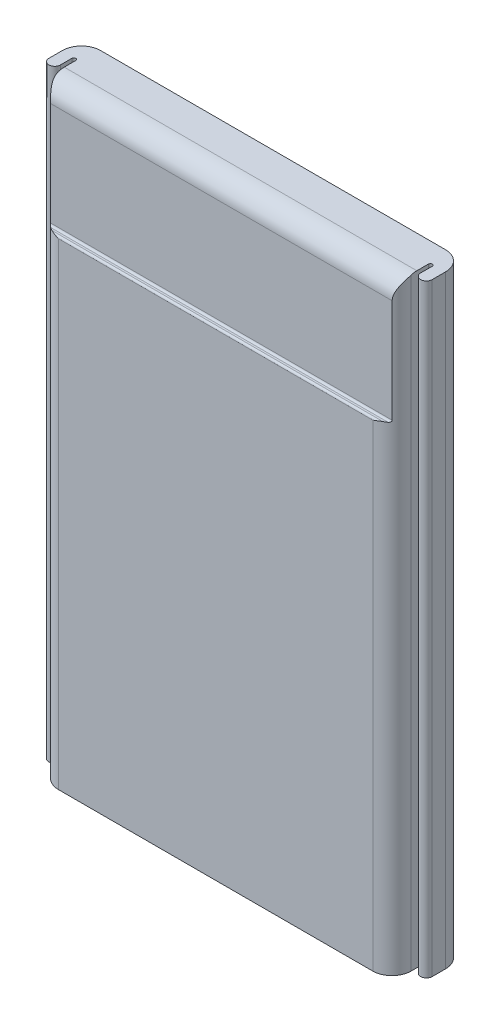
ISO-10303-21;
HEADER;
FILE_DESCRIPTION(('STEP AP214'),'2;1');
FILE_NAME('part.step','',(''),(''),'','','');
FILE_SCHEMA(('AUTOMOTIVE_DESIGN { 1 0 10303 214 1 1 1 1 }'));
ENDSEC;
DATA;
#1=APPLICATION_CONTEXT('core data for automotive mechanical design processes');
#2=APPLICATION_PROTOCOL_DEFINITION('international standard','automotive_design',2000,#1);
#3=PRODUCT_CONTEXT('',#1,'mechanical');
#4=PRODUCT('Part','Part','',(#3));
#5=PRODUCT_RELATED_PRODUCT_CATEGORY('part','',(#4));
#6=PRODUCT_DEFINITION_FORMATION('','',#4);
#7=PRODUCT_DEFINITION_CONTEXT('part definition',#1,'design');
#8=PRODUCT_DEFINITION('design','',#6,#7);
#9=PRODUCT_DEFINITION_SHAPE('','',#8);
#10=(LENGTH_UNIT() NAMED_UNIT(*) SI_UNIT(.MILLI.,.METRE.));
#11=(NAMED_UNIT(*) PLANE_ANGLE_UNIT() SI_UNIT($,.RADIAN.));
#12=(NAMED_UNIT(*) SI_UNIT($,.STERADIAN.) SOLID_ANGLE_UNIT());
#13=UNCERTAINTY_MEASURE_WITH_UNIT(LENGTH_MEASURE(1.E-05),#10,'distance_accuracy_value','');
#14=(GEOMETRIC_REPRESENTATION_CONTEXT(3) GLOBAL_UNCERTAINTY_ASSIGNED_CONTEXT((#13)) GLOBAL_UNIT_ASSIGNED_CONTEXT((#10,
#11,#12)) REPRESENTATION_CONTEXT('',''));
#15=CARTESIAN_POINT('',(0.,0.,0.));
#16=DIRECTION('',(0.,0.,1.));
#17=DIRECTION('',(1.,0.,0.));
#18=AXIS2_PLACEMENT_3D('',#15,#16,#17);
#19=CARTESIAN_POINT('',(-9.2,15.75,2.));
#20=DIRECTION('',(1.,0.,0.));
#21=DIRECTION('',(0.,0.,-1.));
#22=AXIS2_PLACEMENT_3D('',#19,#20,#21);
#23=PLANE('',#22);
#24=CARTESIAN_POINT('',(-9.2,14.75,1.7));
#25=DIRECTION('',(1.,0.,0.));
#26=DIRECTION('',(0.,0.,-1.));
#27=AXIS2_PLACEMENT_3D('',#24,#25,#26);
#28=CIRCLE('',#27,1.);
#29=CARTESIAN_POINT('',(-9.2,15.75,1.7));
#30=VERTEX_POINT('',#29);
#31=CARTESIAN_POINT('',(-9.2,15.7039392014169,2.));
#32=VERTEX_POINT('',#31);
#33=EDGE_CURVE('E352',#30,#32,#28,.T.);
#34=ORIENTED_EDGE('',*,*,#33,.F.);
#35=DIRECTION('',(0.,0.,1.));
#36=VECTOR('',#35,1.);
#37=CARTESIAN_POINT('',(-9.2,15.75,2.));
#38=LINE('',#37,#36);
#39=CARTESIAN_POINT('',(-9.2,15.75,1.1));
#40=VERTEX_POINT('',#39);
#41=EDGE_CURVE('E266',#40,#30,#38,.T.);
#42=ORIENTED_EDGE('',*,*,#41,.F.);
#43=DIRECTION('',(0.,-1.,0.));
#44=VECTOR('',#43,1.);
#45=CARTESIAN_POINT('',(-9.2,15.75,1.1));
#46=LINE('',#45,#44);
#47=CARTESIAN_POINT('',(-9.2,-15.75,1.1));
#48=VERTEX_POINT('',#47);
#49=EDGE_CURVE('E234',#40,#48,#46,.T.);
#50=ORIENTED_EDGE('',*,*,#49,.T.);
#51=DIRECTION('',(0.,0.,1.));
#52=VECTOR('',#51,1.);
#53=CARTESIAN_POINT('',(-9.2,-15.75,2.));
#54=LINE('',#53,#52);
#55=CARTESIAN_POINT('',(-9.2,-15.75,2.));
#56=VERTEX_POINT('',#55);
#57=EDGE_CURVE('E189',#48,#56,#54,.T.);
#58=ORIENTED_EDGE('',*,*,#57,.T.);
#59=DIRECTION('',(0.,-1.,0.));
#60=VECTOR('',#59,1.);
#61=CARTESIAN_POINT('',(-9.2,15.75,2.));
#62=LINE('',#61,#60);
#63=EDGE_CURVE('E232',#32,#56,#62,.T.);
#64=ORIENTED_EDGE('',*,*,#63,.F.);
#65=EDGE_LOOP('',(#34,#42,#50,#58,#64));
#66=FACE_BOUND('',#65,.T.);
#67=ADVANCED_FACE('F33',(#66),#23,.F.);
#68=CARTESIAN_POINT('',(-8.2,15.75,2.));
#69=DIRECTION('',(0.,-1.,0.));
#70=DIRECTION('',(0.,0.,-1.));
#71=AXIS2_PLACEMENT_3D('',#68,#69,#70);
#72=CYLINDRICAL_SURFACE('',#71,1.);
#73=CARTESIAN_POINT('',(-8.63588989435407,9.25,2.9));
#74=CARTESIAN_POINT('',(-8.62141986272507,9.24998087573132,2.90701007655206));
#75=CARTESIAN_POINT('',(-8.60680063521626,9.249265460495,2.91365781850025));
#76=CARTESIAN_POINT('',(-8.57736908394676,9.24672262065517,2.9262002892041));
#77=CARTESIAN_POINT('',(-8.56255720842469,9.2448974387364,2.93209650769148));
#78=CARTESIAN_POINT('',(-8.53284830524129,9.2404225906742,2.9431131265884));
#79=CARTESIAN_POINT('',(-8.51795188291083,9.23777636485903,2.9482366340857));
#80=CARTESIAN_POINT('',(-8.48804583844084,9.23183451609579,2.9577452026079));
#81=CARTESIAN_POINT('',(-8.47303615026111,9.22853848071702,2.96212979134967));
#82=CARTESIAN_POINT('',(-8.4163650565092,9.2151982077031,2.97726275689995));
#83=CARTESIAN_POINT('',(-8.37442664252362,9.20351216028516,2.98558260665678));
#84=CARTESIAN_POINT('',(-8.290325698292,9.17852787413607,2.99681649533091));
#85=CARTESIAN_POINT('',(-8.24816307302738,9.16522888936434,2.99972802247117));
#86=CARTESIAN_POINT('',(-8.20402009359138,9.15127126037265,2.99999392645252));
#87=CARTESIAN_POINT('',(-8.20201000569979,9.15063561401819,2.99999998538536));
#88=CARTESIAN_POINT('',(-8.2,9.15,3.));
#89=B_SPLINE_CURVE_WITH_KNOTS('',3,(#73,#74,#75,#76,#77,#78,#79,#80,#81,#82,#83,#84,#85,#86,#87,
#88),.UNSPECIFIED.,.F.,.F.,(4,2,2,2,2,2,2,4),(0.,0.0481832877468181,0.0962695258808907,
0.144156934372793,0.192074835171756,0.324576413514661,0.457139513943923,0.463464095400243),.UNSPECIFIED.);
#90=CARTESIAN_POINT('',(-8.63588989435407,9.25,2.9));
#91=VERTEX_POINT('',#90);
#92=CARTESIAN_POINT('',(-8.2,9.15,3.));
#93=VERTEX_POINT('',#92);
#94=EDGE_CURVE('E444',#91,#93,#89,.T.);
#95=ORIENTED_EDGE('',*,*,#94,.F.);
#96=CARTESIAN_POINT('',(-8.2,9.25000000000002,2.));
#97=DIRECTION('',(0.,-1.,0.));
#98=DIRECTION('',(0.,0.,-1.));
#99=AXIS2_PLACEMENT_3D('',#96,#97,#98);
#100=CIRCLE('',#99,1.);
#101=CARTESIAN_POINT('',(-8.8,9.25,2.8));
#102=VERTEX_POINT('',#101);
#103=EDGE_CURVE('E437',#102,#91,#100,.F.);
#104=ORIENTED_EDGE('',*,*,#103,.F.);
#105=CARTESIAN_POINT('',(-8.91414284285428,9.35,2.7));
#106=CARTESIAN_POINT('',(-8.91414892932907,9.34554082044777,2.69999248786504));
#107=CARTESIAN_POINT('',(-8.91385100928084,9.34109105978861,2.70029775881517));
#108=CARTESIAN_POINT('',(-8.91269946911093,9.33237385605732,2.70147031420301));
#109=CARTESIAN_POINT('',(-8.91185013245652,9.32810527562642,2.70233326627442));
#110=CARTESIAN_POINT('',(-8.90964909067605,9.31985056758852,2.70455690691447));
#111=CARTESIAN_POINT('',(-8.90829849305574,9.31586384019123,2.70591649808541));
#112=CARTESIAN_POINT('',(-8.9051647999995,9.3082318158491,2.70904693614613));
#113=CARTESIAN_POINT('',(-8.90338086157945,9.30458720382192,2.71081858432721));
#114=CARTESIAN_POINT('',(-8.89873663552692,9.29642694037252,2.71538878436792));
#115=CARTESIAN_POINT('',(-8.89572098915064,9.29207766848785,2.71832631291176));
#116=CARTESIAN_POINT('',(-8.88918388091441,9.28411566029749,2.7246007473437));
#117=CARTESIAN_POINT('',(-8.88566172310057,9.28050395421841,2.72793820166588));
#118=CARTESIAN_POINT('',(-8.87669097912739,9.27261778198106,2.73630199852206));
#119=CARTESIAN_POINT('',(-8.87105118784124,9.26869416928687,2.74145263873207));
#120=CARTESIAN_POINT('',(-8.85925009770882,9.26207119566238,2.75196575389125));
#121=CARTESIAN_POINT('',(-8.85308673120159,9.25937698437018,2.75732901943856));
#122=CARTESIAN_POINT('',(-8.83927422728284,9.25466665217824,2.7690409236125));
#123=CARTESIAN_POINT('',(-8.83155784470155,9.25286100010372,2.77539251526355));
#124=CARTESIAN_POINT('',(-8.81591479874564,9.25054066846311,2.78787712135895));
#125=CARTESIAN_POINT('',(-8.80799191828697,9.25001029273861,2.79401186785644));
#126=CARTESIAN_POINT('',(-8.80000000000311,9.24999999998508,2.79999999999768));
#127=B_SPLINE_CURVE_WITH_KNOTS('',3,(#105,#106,#107,#108,#109,#110,#111,#112,#113,#114,#115,
#116,#117,#118,#119,#120,#121,#122,#123,#124,#125,#126),.UNSPECIFIED.,.F.,.F.,(4,2,2,2,2,2,2,2,
2,2,4),(0.,0.0133422524322342,0.0265820811673206,0.0397928297781971,0.053029486202403,
0.0710883037595157,0.0891721757659234,0.114790772465896,0.140515715263545,0.17088861297908,
0.200885721822071),.UNSPECIFIED.);
#128=CARTESIAN_POINT('',(-8.91414284285428,9.35,2.7));
#129=VERTEX_POINT('',#128);
#130=EDGE_CURVE('E443',#129,#102,#127,.T.);
#131=ORIENTED_EDGE('',*,*,#130,.F.);
#132=DIRECTION('',(0.,-1.,0.));
#133=VECTOR('',#132,1.);
#134=CARTESIAN_POINT('',(-8.91414284285428,15.75,2.7));
#135=LINE('',#134,#133);
#136=CARTESIAN_POINT('',(-8.91414284285428,14.75,2.7));
#137=VERTEX_POINT('',#136);
#138=EDGE_CURVE('E464',#137,#129,#135,.T.);
#139=ORIENTED_EDGE('',*,*,#138,.F.);
#140=CARTESIAN_POINT('',(-9.2,15.7039392014169,2.));
#141=CARTESIAN_POINT('',(-9.20000312078413,15.6964536809527,2.02381416730361));
#142=CARTESIAN_POINT('',(-9.19914905430429,15.6880761226066,2.04732401697071));
#143=CARTESIAN_POINT('',(-9.195884721432,15.6696464909386,2.09353136410262));
#144=CARTESIAN_POINT('',(-9.19347656634759,15.6595967031518,2.11622991966311));
#145=CARTESIAN_POINT('',(-9.18421620881141,15.6272864065625,2.18245346211998));
#146=CARTESIAN_POINT('',(-9.17532160964766,15.6027105982703,2.22459058407956));
#147=CARTESIAN_POINT('',(-9.1535866732435,15.5484969944097,2.30390995109177));
#148=CARTESIAN_POINT('',(-9.1407662679136,15.5188850979876,2.34111589558791));
#149=CARTESIAN_POINT('',(-9.11259783960253,15.4552002532373,2.41057652314389));
#150=CARTESIAN_POINT('',(-9.09724238003995,15.4211142422482,2.44281608277366));
#151=CARTESIAN_POINT('',(-9.06314530017132,15.3437569751299,2.50642552762656));
#152=CARTESIAN_POINT('',(-9.04423888763364,15.2998729332956,2.53696040381006));
#153=CARTESIAN_POINT('',(-9.00745547682631,15.2074744239607,2.59082757613575));
#154=CARTESIAN_POINT('',(-8.9895781328426,15.1589615262456,2.61416230278105));
#155=CARTESIAN_POINT('',(-8.96084548288959,15.0675421180144,2.64924963242335));
#156=CARTESIAN_POINT('',(-8.94930068457804,15.0253825349463,2.66237259843258));
#157=CARTESIAN_POINT('',(-8.93055164453238,14.938849800102,2.6830035726455));
#158=CARTESIAN_POINT('',(-8.92333138813645,14.8944854825908,2.69053232262124));
#159=CARTESIAN_POINT('',(-8.91738451703661,14.8330985372838,2.69668016076469));
#160=CARTESIAN_POINT('',(-8.91617436932656,14.8165388836832,2.69792250734469));
#161=CARTESIAN_POINT('',(-8.91455226224722,14.7833221705958,2.69958287914671));
#162=CARTESIAN_POINT('',(-8.91414113826436,14.7666650274066,2.70000004163951));
#163=CARTESIAN_POINT('',(-8.91414284285428,14.75,2.7));
#164=B_SPLINE_CURVE_WITH_KNOTS('',3,(#140,#141,#142,#143,#144,#145,#146,#147,#148,#149,#150,
#151,#152,#153,#154,#155,#156,#157,#158,#159,#160,#161,#162,#163),.UNSPECIFIED.,.F.,.F.,(4,2,2,
2,2,2,2,2,2,2,2,4),(0.,0.0748174640596608,0.149533498174081,0.297465166621174,0.444657878679366,
0.592290313818854,0.761774077816249,0.931200567641228,1.06764661117946,1.20358419180516,
1.253501732853,1.30347143511961),.UNSPECIFIED.);
#165=EDGE_CURVE('E466',#32,#137,#164,.T.);
#166=ORIENTED_EDGE('',*,*,#165,.F.);
#167=ORIENTED_EDGE('',*,*,#63,.T.);
#168=CARTESIAN_POINT('',(-8.2,-15.75,2.));
#169=DIRECTION('',(0.,1.,0.));
#170=DIRECTION('',(0.,0.,1.));
#171=AXIS2_PLACEMENT_3D('',#168,#169,#170);
#172=CIRCLE('',#171,1.);
#173=CARTESIAN_POINT('',(-8.2,-15.75,3.));
#174=VERTEX_POINT('',#173);
#175=EDGE_CURVE('E192',#56,#174,#172,.T.);
#176=ORIENTED_EDGE('',*,*,#175,.T.);
#177=DIRECTION('',(0.,-1.,0.));
#178=VECTOR('',#177,1.);
#179=CARTESIAN_POINT('',(-8.2,15.75,3.));
#180=LINE('',#179,#178);
#181=EDGE_CURVE('E230',#93,#174,#180,.T.);
#182=ORIENTED_EDGE('',*,*,#181,.F.);
#183=EDGE_LOOP('',(#95,#104,#131,#139,#166,#167,#176,#182));
#184=FACE_BOUND('',#183,.T.);
#185=ADVANCED_FACE('F370',(#184),#72,.T.);
#186=CARTESIAN_POINT('',(8.2,15.75,2.));
#187=DIRECTION('',(0.,-1.,0.));
#188=DIRECTION('',(0.,0.,-1.));
#189=AXIS2_PLACEMENT_3D('',#186,#187,#188);
#190=CYLINDRICAL_SURFACE('',#189,1.);
#191=CARTESIAN_POINT('',(8.63588989435406,9.25,2.9));
#192=CARTESIAN_POINT('',(8.62141986272506,9.24998087573132,2.90701007655207));
#193=CARTESIAN_POINT('',(8.60680063521624,9.249265460495,2.91365781850025));
#194=CARTESIAN_POINT('',(8.57736908394673,9.24672262065516,2.92620028920411));
#195=CARTESIAN_POINT('',(8.56255720842465,9.2448974387364,2.93209650769149));
#196=CARTESIAN_POINT('',(8.53284830524126,9.2404225906742,2.94311312658841));
#197=CARTESIAN_POINT('',(8.5179518829108,9.23777636485902,2.94823663408571));
#198=CARTESIAN_POINT('',(8.48804583844083,9.23183451609578,2.9577452026079));
#199=CARTESIAN_POINT('',(8.4730361502611,9.22853848071701,2.96212979134967));
#200=CARTESIAN_POINT('',(8.4163650565092,9.21519820770312,2.97726275689995));
#201=CARTESIAN_POINT('',(8.37442664252358,9.20351216028531,2.98558260665678));
#202=CARTESIAN_POINT('',(8.29032569829205,9.17852787413592,2.99681649533091));
#203=CARTESIAN_POINT('',(8.24816307302757,9.16522888936375,2.99972802247117));
#204=CARTESIAN_POINT('',(8.20402009359139,9.1512712603726,2.99999392645252));
#205=CARTESIAN_POINT('',(8.2020100056998,9.15063561401816,2.99999998538536));
#206=CARTESIAN_POINT('',(8.2,9.15,3.));
#207=B_SPLINE_CURVE_WITH_KNOTS('',3,(#191,#192,#193,#194,#195,#196,#197,#198,#199,#200,#201,
#202,#203,#204,#205,#206),.UNSPECIFIED.,.F.,.F.,(4,2,2,2,2,2,2,4),(0.,0.0481832877468447,
0.0962695258809393,0.144156934372813,0.192074835171751,0.324576413514647,0.457139513943925,
0.463464095400246),.UNSPECIFIED.);
#208=CARTESIAN_POINT('',(8.63588989435406,9.25,2.9));
#209=VERTEX_POINT('',#208);
#210=CARTESIAN_POINT('',(8.2,9.15,3.));
#211=VERTEX_POINT('',#210);
#212=EDGE_CURVE('E324',#209,#211,#207,.T.);
#213=ORIENTED_EDGE('',*,*,#212,.T.);
#214=DIRECTION('',(0.,-1.,0.));
#215=VECTOR('',#214,1.);
#216=CARTESIAN_POINT('',(8.2,15.75,3.));
#217=LINE('',#216,#215);
#218=CARTESIAN_POINT('',(8.2,-15.75,3.));
#219=VERTEX_POINT('',#218);
#220=EDGE_CURVE('E228',#211,#219,#217,.T.);
#221=ORIENTED_EDGE('',*,*,#220,.T.);
#222=CARTESIAN_POINT('',(8.2,-15.75,2.));
#223=DIRECTION('',(0.,1.,0.));
#224=DIRECTION('',(0.,0.,-1.));
#225=AXIS2_PLACEMENT_3D('',#222,#223,#224);
#226=CIRCLE('',#225,1.);
#227=CARTESIAN_POINT('',(9.2,-15.75,2.));
#228=VERTEX_POINT('',#227);
#229=EDGE_CURVE('E198',#219,#228,#226,.T.);
#230=ORIENTED_EDGE('',*,*,#229,.T.);
#231=DIRECTION('',(0.,-1.,0.));
#232=VECTOR('',#231,1.);
#233=CARTESIAN_POINT('',(9.2,15.75,2.));
#234=LINE('',#233,#232);
#235=CARTESIAN_POINT('',(9.2,15.7039392014169,2.));
#236=VERTEX_POINT('',#235);
#237=EDGE_CURVE('E226',#236,#228,#234,.T.);
#238=ORIENTED_EDGE('',*,*,#237,.F.);
#239=CARTESIAN_POINT('',(9.2,15.7039392014169,2.));
#240=CARTESIAN_POINT('',(9.20000312078413,15.6964536809527,2.02381416730361));
#241=CARTESIAN_POINT('',(9.19914905430428,15.6880761226066,2.04732401697071));
#242=CARTESIAN_POINT('',(9.19588472143199,15.6696464909386,2.09353136410262));
#243=CARTESIAN_POINT('',(9.19347656634759,15.6595967031518,2.11622991966311));
#244=CARTESIAN_POINT('',(9.18421620881141,15.6272864065625,2.18245346211998));
#245=CARTESIAN_POINT('',(9.17532160964765,15.6027105982703,2.22459058407956));
#246=CARTESIAN_POINT('',(9.15358667324349,15.5484969944097,2.30390995109177));
#247=CARTESIAN_POINT('',(9.14076626791359,15.5188850979876,2.34111589558791));
#248=CARTESIAN_POINT('',(9.11259783960252,15.4552002532373,2.41057652314389));
#249=CARTESIAN_POINT('',(9.09724238003994,15.4211142422482,2.44281608277366));
#250=CARTESIAN_POINT('',(9.06314530017132,15.3437569751299,2.50642552762656));
#251=CARTESIAN_POINT('',(9.04423888763364,15.2998729332956,2.53696040381006));
#252=CARTESIAN_POINT('',(9.0074554768263,15.2074744239607,2.59082757613575));
#253=CARTESIAN_POINT('',(8.98957813284259,15.1589615262456,2.61416230278106));
#254=CARTESIAN_POINT('',(8.96084548288959,15.0675421180144,2.64924963242335));
#255=CARTESIAN_POINT('',(8.94930068457803,15.0253825349463,2.66237259843258));
#256=CARTESIAN_POINT('',(8.93055164453238,14.938849800102,2.6830035726455));
#257=CARTESIAN_POINT('',(8.92333138813645,14.8944854825908,2.69053232262124));
#258=CARTESIAN_POINT('',(8.91738451703661,14.8330985372838,2.69668016076469));
#259=CARTESIAN_POINT('',(8.91617436932656,14.8165388836832,2.69792250734469));
#260=CARTESIAN_POINT('',(8.91455226224722,14.7833221705958,2.69958287914671));
#261=CARTESIAN_POINT('',(8.91414113826436,14.7666650274066,2.70000004163951));
#262=CARTESIAN_POINT('',(8.91414284285428,14.75,2.7));
#263=B_SPLINE_CURVE_WITH_KNOTS('',3,(#239,#240,#241,#242,#243,#244,#245,#246,#247,#248,#249,
#250,#251,#252,#253,#254,#255,#256,#257,#258,#259,#260,#261,#262),.UNSPECIFIED.,.F.,.F.,(4,2,2,
2,2,2,2,2,2,2,2,4),(0.,0.0748174640596608,0.149533498174082,0.297465166621174,0.444657878679366,
0.592290313818854,0.761774077816251,0.931200567641228,1.06764661117946,1.20358419180517,
1.253501732853,1.30347143511961),.UNSPECIFIED.);
#264=CARTESIAN_POINT('',(8.91414284285428,14.75,2.7));
#265=VERTEX_POINT('',#264);
#266=EDGE_CURVE('E315',#236,#265,#263,.T.);
#267=ORIENTED_EDGE('',*,*,#266,.T.);
#268=DIRECTION('',(0.,-1.,0.));
#269=VECTOR('',#268,1.);
#270=CARTESIAN_POINT('',(8.91414284285428,15.75,2.7));
#271=LINE('',#270,#269);
#272=CARTESIAN_POINT('',(8.91414284285428,9.35,2.7));
#273=VERTEX_POINT('',#272);
#274=EDGE_CURVE('E181',#265,#273,#271,.T.);
#275=ORIENTED_EDGE('',*,*,#274,.T.);
#276=CARTESIAN_POINT('',(8.91414284285428,9.35,2.7));
#277=CARTESIAN_POINT('',(8.91414892932907,9.34554082044777,2.69999248786504));
#278=CARTESIAN_POINT('',(8.91385100928084,9.34109105978861,2.70029775881517));
#279=CARTESIAN_POINT('',(8.91269946911093,9.33237385605732,2.70147031420301));
#280=CARTESIAN_POINT('',(8.91185013245652,9.32810527562642,2.70233326627442));
#281=CARTESIAN_POINT('',(8.90964909067605,9.31985056758852,2.70455690691447));
#282=CARTESIAN_POINT('',(8.90829849305574,9.31586384019123,2.70591649808541));
#283=CARTESIAN_POINT('',(8.9051647999995,9.3082318158491,2.70904693614613));
#284=CARTESIAN_POINT('',(8.90338086157945,9.30458720382192,2.71081858432721));
#285=CARTESIAN_POINT('',(8.89873663552692,9.29642694037252,2.71538878436792));
#286=CARTESIAN_POINT('',(8.89572098915064,9.29207766848785,2.71832631291176));
#287=CARTESIAN_POINT('',(8.88918388091441,9.28411566029749,2.7246007473437));
#288=CARTESIAN_POINT('',(8.88566172310057,9.28050395421841,2.72793820166588));
#289=CARTESIAN_POINT('',(8.87669097912739,9.27261778198106,2.73630199852206));
#290=CARTESIAN_POINT('',(8.87105118784124,9.26869416928687,2.74145263873207));
#291=CARTESIAN_POINT('',(8.85925009770882,9.26207119566238,2.75196575389125));
#292=CARTESIAN_POINT('',(8.85308673120159,9.25937698437018,2.75732901943856));
#293=CARTESIAN_POINT('',(8.83927422728284,9.25466665217824,2.7690409236125));
#294=CARTESIAN_POINT('',(8.83155784470154,9.25286100010372,2.77539251526354));
#295=CARTESIAN_POINT('',(8.81591479874564,9.25054066846311,2.78787712135895));
#296=CARTESIAN_POINT('',(8.80799191828697,9.25001029273861,2.79401186785644));
#297=CARTESIAN_POINT('',(8.80000000000311,9.24999999998508,2.79999999999768));
#298=B_SPLINE_CURVE_WITH_KNOTS('',3,(#276,#277,#278,#279,#280,#281,#282,#283,#284,#285,#286,
#287,#288,#289,#290,#291,#292,#293,#294,#295,#296,#297),.UNSPECIFIED.,.F.,.F.,(4,2,2,2,2,2,2,2,
2,2,4),(0.,0.0133422524322342,0.0265820811673206,0.0397928297781966,0.0530294862024032,
0.071088303759515,0.0891721757659225,0.114790772465894,0.140515715263544,0.170888612979076,
0.200885721822071),.UNSPECIFIED.);
#299=CARTESIAN_POINT('',(8.8,9.25,2.8));
#300=VERTEX_POINT('',#299);
#301=EDGE_CURVE('E344',#273,#300,#298,.T.);
#302=ORIENTED_EDGE('',*,*,#301,.T.);
#303=CARTESIAN_POINT('',(8.2,9.25000000000002,2.));
#304=DIRECTION('',(0.,1.,0.));
#305=DIRECTION('',(0.,0.,1.));
#306=AXIS2_PLACEMENT_3D('',#303,#304,#305);
#307=CIRCLE('',#306,1.);
#308=EDGE_CURVE('E351',#300,#209,#307,.F.);
#309=ORIENTED_EDGE('',*,*,#308,.T.);
#310=EDGE_LOOP('',(#213,#221,#230,#238,#267,#275,#302,#309));
#311=FACE_BOUND('',#310,.T.);
#312=ADVANCED_FACE('F376',(#311),#190,.T.);
#313=CARTESIAN_POINT('',(9.2,15.75,1.1));
#314=DIRECTION('',(-1.,0.,0.));
#315=DIRECTION('',(0.,0.,1.));
#316=AXIS2_PLACEMENT_3D('',#313,#314,#315);
#317=PLANE('',#316);
#318=CARTESIAN_POINT('',(9.2,14.75,1.7));
#319=DIRECTION('',(-1.,0.,0.));
#320=DIRECTION('',(0.,0.,1.));
#321=AXIS2_PLACEMENT_3D('',#318,#319,#320);
#322=CIRCLE('',#321,1.);
#323=CARTESIAN_POINT('',(9.2,15.75,1.7));
#324=VERTEX_POINT('',#323);
#325=EDGE_CURVE('E48',#324,#236,#322,.F.);
#326=ORIENTED_EDGE('',*,*,#325,.T.);
#327=ORIENTED_EDGE('',*,*,#237,.T.);
#328=DIRECTION('',(0.,0.,-1.));
#329=VECTOR('',#328,1.);
#330=CARTESIAN_POINT('',(9.2,-15.75,1.1));
#331=LINE('',#330,#329);
#332=CARTESIAN_POINT('',(9.2,-15.75,1.1));
#333=VERTEX_POINT('',#332);
#334=EDGE_CURVE('E201',#228,#333,#331,.T.);
#335=ORIENTED_EDGE('',*,*,#334,.T.);
#336=DIRECTION('',(0.,-1.,0.));
#337=VECTOR('',#336,1.);
#338=CARTESIAN_POINT('',(9.2,15.75,1.1));
#339=LINE('',#338,#337);
#340=CARTESIAN_POINT('',(9.2,15.75,1.1));
#341=VERTEX_POINT('',#340);
#342=EDGE_CURVE('E223',#341,#333,#339,.T.);
#343=ORIENTED_EDGE('',*,*,#342,.F.);
#344=DIRECTION('',(0.,0.,-1.));
#345=VECTOR('',#344,1.);
#346=CARTESIAN_POINT('',(9.2,15.75,1.1));
#347=LINE('',#346,#345);
#348=EDGE_CURVE('E269',#324,#341,#347,.T.);
#349=ORIENTED_EDGE('',*,*,#348,.F.);
#350=EDGE_LOOP('',(#326,#327,#335,#343,#349));
#351=FACE_BOUND('',#350,.T.);
#352=ADVANCED_FACE('F393',(#351),#317,.F.);
#353=CARTESIAN_POINT('',(-9.,15.75,0.999999999999998));
#354=DIRECTION('',(0.,-1.,0.));
#355=DIRECTION('',(0.,0.,-1.));
#356=AXIS2_PLACEMENT_3D('',#353,#354,#355);
#357=CYLINDRICAL_SURFACE('',#356,0.999999999999999);
#358=CARTESIAN_POINT('',(-9.,-15.75,0.999999999999998));
#359=DIRECTION('',(0.,1.,0.));
#360=DIRECTION('',(0.,0.,1.));
#361=AXIS2_PLACEMENT_3D('',#358,#359,#360);
#362=CIRCLE('',#361,0.999999999999999);
#363=CARTESIAN_POINT('',(-9.,-15.75,0.));
#364=VERTEX_POINT('',#363);
#365=CARTESIAN_POINT('',(-10.,-15.75,1.));
#366=VERTEX_POINT('',#365);
#367=EDGE_CURVE('E177',#364,#366,#362,.T.);
#368=ORIENTED_EDGE('',*,*,#367,.T.);
#369=DIRECTION('',(0.,-1.,0.));
#370=VECTOR('',#369,1.);
#371=CARTESIAN_POINT('',(-10.,15.75,1.));
#372=LINE('',#371,#370);
#373=CARTESIAN_POINT('',(-10.,15.75,1.));
#374=VERTEX_POINT('',#373);
#375=EDGE_CURVE('E11',#374,#366,#372,.T.);
#376=ORIENTED_EDGE('',*,*,#375,.F.);
#377=CARTESIAN_POINT('',(-9.,15.75,0.999999999999998));
#378=DIRECTION('',(0.,1.,0.));
#379=DIRECTION('',(0.,0.,1.));
#380=AXIS2_PLACEMENT_3D('',#377,#378,#379);
#381=CIRCLE('',#380,0.999999999999999);
#382=CARTESIAN_POINT('',(-9.,15.75,0.));
#383=VERTEX_POINT('',#382);
#384=EDGE_CURVE('E213',#383,#374,#381,.T.);
#385=ORIENTED_EDGE('',*,*,#384,.F.);
#386=DIRECTION('',(0.,-1.,0.));
#387=VECTOR('',#386,1.);
#388=CARTESIAN_POINT('',(-9.,15.75,0.));
#389=LINE('',#388,#387);
#390=EDGE_CURVE('E173',#383,#364,#389,.T.);
#391=ORIENTED_EDGE('',*,*,#390,.T.);
#392=EDGE_LOOP('',(#368,#376,#385,#391));
#393=FACE_BOUND('',#392,.T.);
#394=ADVANCED_FACE('F35',(#393),#357,.T.);
#395=CARTESIAN_POINT('',(-10.,15.75,1.));
#396=DIRECTION('',(1.,0.,0.));
#397=DIRECTION('',(0.,0.,-1.));
#398=AXIS2_PLACEMENT_3D('',#395,#396,#397);
#399=PLANE('',#398);
#400=DIRECTION('',(0.,0.,1.));
#401=VECTOR('',#400,1.);
#402=CARTESIAN_POINT('',(-10.,-15.75,1.));
#403=LINE('',#402,#401);
#404=CARTESIAN_POINT('',(-10.,-15.75,1.7));
#405=VERTEX_POINT('',#404);
#406=EDGE_CURVE('E180',#366,#405,#403,.T.);
#407=ORIENTED_EDGE('',*,*,#406,.T.);
#408=DIRECTION('',(0.,-1.,0.));
#409=VECTOR('',#408,1.);
#410=CARTESIAN_POINT('',(-10.,15.75,1.7));
#411=LINE('',#410,#409);
#412=CARTESIAN_POINT('',(-10.,15.75,1.7));
#413=VERTEX_POINT('',#412);
#414=EDGE_CURVE('E41',#413,#405,#411,.T.);
#415=ORIENTED_EDGE('',*,*,#414,.F.);
#416=DIRECTION('',(0.,0.,1.));
#417=VECTOR('',#416,1.);
#418=CARTESIAN_POINT('',(-10.,15.75,1.));
#419=LINE('',#418,#417);
#420=EDGE_CURVE('E122',#374,#413,#419,.T.);
#421=ORIENTED_EDGE('',*,*,#420,.F.);
#422=ORIENTED_EDGE('',*,*,#375,.T.);
#423=EDGE_LOOP('',(#407,#415,#421,#422));
#424=FACE_BOUND('',#423,.T.);
#425=ADVANCED_FACE('F388',(#424),#399,.F.);
#426=CARTESIAN_POINT('',(-9.7,15.75,1.7));
#427=DIRECTION('',(0.,-1.,0.));
#428=DIRECTION('',(0.,0.,-1.));
#429=AXIS2_PLACEMENT_3D('',#426,#427,#428);
#430=CYLINDRICAL_SURFACE('',#429,0.300000000000002);
#431=CARTESIAN_POINT('',(-9.7,-15.75,1.7));
#432=DIRECTION('',(0.,1.,0.));
#433=DIRECTION('',(0.,0.,1.));
#434=AXIS2_PLACEMENT_3D('',#431,#432,#433);
#435=CIRCLE('',#434,0.300000000000002);
#436=CARTESIAN_POINT('',(-9.4,-15.75,1.7));
#437=VERTEX_POINT('',#436);
#438=EDGE_CURVE('E183',#405,#437,#435,.T.);
#439=ORIENTED_EDGE('',*,*,#438,.T.);
#440=DIRECTION('',(0.,-1.,0.));
#441=VECTOR('',#440,1.);
#442=CARTESIAN_POINT('',(-9.4,15.75,1.7));
#443=LINE('',#442,#441);
#444=CARTESIAN_POINT('',(-9.4,15.75,1.7));
#445=VERTEX_POINT('',#444);
#446=EDGE_CURVE('E240',#445,#437,#443,.T.);
#447=ORIENTED_EDGE('',*,*,#446,.F.);
#448=CARTESIAN_POINT('',(-9.7,15.75,1.7));
#449=DIRECTION('',(0.,1.,0.));
#450=DIRECTION('',(0.,0.,1.));
#451=AXIS2_PLACEMENT_3D('',#448,#449,#450);
#452=CIRCLE('',#451,0.300000000000002);
#453=EDGE_CURVE('E248',#413,#445,#452,.T.);
#454=ORIENTED_EDGE('',*,*,#453,.F.);
#455=ORIENTED_EDGE('',*,*,#414,.T.);
#456=EDGE_LOOP('',(#439,#447,#454,#455));
#457=FACE_BOUND('',#456,.T.);
#458=ADVANCED_FACE('F246',(#457),#430,.T.);
#459=CARTESIAN_POINT('',(-9.4,15.75,1.7));
#460=DIRECTION('',(-1.,0.,0.));
#461=DIRECTION('',(0.,0.,1.));
#462=AXIS2_PLACEMENT_3D('',#459,#460,#461);
#463=PLANE('',#462);
#464=DIRECTION('',(0.,0.,-1.));
#465=VECTOR('',#464,1.);
#466=CARTESIAN_POINT('',(-9.4,-15.75,1.7));
#467=LINE('',#466,#465);
#468=CARTESIAN_POINT('',(-9.4,-15.75,1.1));
#469=VERTEX_POINT('',#468);
#470=EDGE_CURVE('E185',#437,#469,#467,.T.);
#471=ORIENTED_EDGE('',*,*,#470,.T.);
#472=DIRECTION('',(0.,-1.,0.));
#473=VECTOR('',#472,1.);
#474=CARTESIAN_POINT('',(-9.4,15.75,1.1));
#475=LINE('',#474,#473);
#476=CARTESIAN_POINT('',(-9.4,15.75,1.1));
#477=VERTEX_POINT('',#476);
#478=EDGE_CURVE('E237',#477,#469,#475,.T.);
#479=ORIENTED_EDGE('',*,*,#478,.F.);
#480=DIRECTION('',(0.,0.,-1.));
#481=VECTOR('',#480,1.);
#482=CARTESIAN_POINT('',(-9.4,15.75,1.7));
#483=LINE('',#482,#481);
#484=EDGE_CURVE('E267',#445,#477,#483,.T.);
#485=ORIENTED_EDGE('',*,*,#484,.F.);
#486=ORIENTED_EDGE('',*,*,#446,.T.);
#487=EDGE_LOOP('',(#471,#479,#485,#486));
#488=FACE_BOUND('',#487,.T.);
#489=ADVANCED_FACE('F257',(#488),#463,.F.);
#490=CARTESIAN_POINT('',(-9.3,15.75,1.1));
#491=DIRECTION('',(0.,-1.,0.));
#492=DIRECTION('',(0.,0.,-1.));
#493=AXIS2_PLACEMENT_3D('',#490,#491,#492);
#494=CYLINDRICAL_SURFACE('',#493,0.0999999999999977);
#495=CARTESIAN_POINT('',(-9.3,-15.75,1.1));
#496=DIRECTION('',(0.,-1.,0.));
#497=DIRECTION('',(0.,0.,1.));
#498=AXIS2_PLACEMENT_3D('',#495,#496,#497);
#499=CIRCLE('',#498,0.0999999999999977);
#500=EDGE_CURVE('E187',#469,#48,#499,.T.);
#501=ORIENTED_EDGE('',*,*,#500,.T.);
#502=ORIENTED_EDGE('',*,*,#49,.F.);
#503=CARTESIAN_POINT('',(-9.3,15.75,1.1));
#504=DIRECTION('',(0.,-1.,0.));
#505=DIRECTION('',(0.,0.,1.));
#506=AXIS2_PLACEMENT_3D('',#503,#504,#505);
#507=CIRCLE('',#506,0.0999999999999977);
#508=EDGE_CURVE('E263',#477,#40,#507,.T.);
#509=ORIENTED_EDGE('',*,*,#508,.F.);
#510=ORIENTED_EDGE('',*,*,#478,.T.);
#511=EDGE_LOOP('',(#501,#502,#509,#510));
#512=FACE_BOUND('',#511,.T.);
#513=ADVANCED_FACE('F261',(#512),#494,.F.);
#514=CARTESIAN_POINT('',(-8.2,15.75,3.));
#515=DIRECTION('',(0.,0.,-1.));
#516=DIRECTION('',(-1.,0.,0.));
#517=AXIS2_PLACEMENT_3D('',#514,#515,#516);
#518=PLANE('',#517);
#519=ORIENTED_EDGE('',*,*,#220,.F.);
#520=DIRECTION('',(-1.,0.,0.));
#521=VECTOR('',#520,1.);
#522=CARTESIAN_POINT('',(10.001,9.15,3.));
#523=LINE('',#522,#521);
#524=EDGE_CURVE('E299',#211,#93,#523,.T.);
#525=ORIENTED_EDGE('',*,*,#524,.T.);
#526=ORIENTED_EDGE('',*,*,#181,.T.);
#527=DIRECTION('',(1.,0.,0.));
#528=VECTOR('',#527,1.);
#529=CARTESIAN_POINT('',(-8.2,-15.75,3.));
#530=LINE('',#529,#528);
#531=EDGE_CURVE('E195',#174,#219,#530,.T.);
#532=ORIENTED_EDGE('',*,*,#531,.T.);
#533=EDGE_LOOP('',(#519,#525,#526,#532));
#534=FACE_BOUND('',#533,.T.);
#535=ADVANCED_FACE('F384',(#534),#518,.F.);
#536=CARTESIAN_POINT('',(9.3,15.75,1.1));
#537=DIRECTION('',(0.,-1.,0.));
#538=DIRECTION('',(0.,0.,-1.));
#539=AXIS2_PLACEMENT_3D('',#536,#537,#538);
#540=CYLINDRICAL_SURFACE('',#539,0.0999999999999977);
#541=CARTESIAN_POINT('',(9.3,-15.75,1.1));
#542=DIRECTION('',(0.,-1.,0.));
#543=DIRECTION('',(0.,0.,-1.));
#544=AXIS2_PLACEMENT_3D('',#541,#542,#543);
#545=CIRCLE('',#544,0.0999999999999977);
#546=CARTESIAN_POINT('',(9.39999999999999,-15.75,1.1));
#547=VERTEX_POINT('',#546);
#548=EDGE_CURVE('E203',#333,#547,#545,.T.);
#549=ORIENTED_EDGE('',*,*,#548,.T.);
#550=DIRECTION('',(0.,-1.,0.));
#551=VECTOR('',#550,1.);
#552=CARTESIAN_POINT('',(9.39999999999999,15.75,1.1));
#553=LINE('',#552,#551);
#554=CARTESIAN_POINT('',(9.39999999999999,15.75,1.1));
#555=VERTEX_POINT('',#554);
#556=EDGE_CURVE('E220',#555,#547,#553,.T.);
#557=ORIENTED_EDGE('',*,*,#556,.F.);
#558=CARTESIAN_POINT('',(9.3,15.75,1.1));
#559=DIRECTION('',(0.,-1.,0.));
#560=DIRECTION('',(0.,0.,-1.));
#561=AXIS2_PLACEMENT_3D('',#558,#559,#560);
#562=CIRCLE('',#561,0.0999999999999977);
#563=EDGE_CURVE('E275',#341,#555,#562,.T.);
#564=ORIENTED_EDGE('',*,*,#563,.F.);
#565=ORIENTED_EDGE('',*,*,#342,.T.);
#566=EDGE_LOOP('',(#549,#557,#564,#565));
#567=FACE_BOUND('',#566,.T.);
#568=ADVANCED_FACE('F405',(#567),#540,.F.);
#569=CARTESIAN_POINT('',(9.39999999999998,15.75,1.70000000000001));
#570=DIRECTION('',(1.,0.,0.));
#571=DIRECTION('',(0.,0.,-1.));
#572=AXIS2_PLACEMENT_3D('',#569,#570,#571);
#573=PLANE('',#572);
#574=DIRECTION('',(0.,0.,1.));
#575=VECTOR('',#574,1.);
#576=CARTESIAN_POINT('',(9.39999999999998,-15.75,1.70000000000001));
#577=LINE('',#576,#575);
#578=CARTESIAN_POINT('',(9.39999999999998,-15.75,1.70000000000001));
#579=VERTEX_POINT('',#578);
#580=EDGE_CURVE('E205',#547,#579,#577,.T.);
#581=ORIENTED_EDGE('',*,*,#580,.T.);
#582=DIRECTION('',(0.,-1.,0.));
#583=VECTOR('',#582,1.);
#584=CARTESIAN_POINT('',(9.39999999999998,15.75,1.70000000000001));
#585=LINE('',#584,#583);
#586=CARTESIAN_POINT('',(9.39999999999998,15.75,1.70000000000001));
#587=VERTEX_POINT('',#586);
#588=EDGE_CURVE('E217',#587,#579,#585,.T.);
#589=ORIENTED_EDGE('',*,*,#588,.F.);
#590=DIRECTION('',(0.,0.,1.));
#591=VECTOR('',#590,1.);
#592=CARTESIAN_POINT('',(9.39999999999998,15.75,1.70000000000001));
#593=LINE('',#592,#591);
#594=EDGE_CURVE('E277',#555,#587,#593,.T.);
#595=ORIENTED_EDGE('',*,*,#594,.F.);
#596=ORIENTED_EDGE('',*,*,#556,.T.);
#597=EDGE_LOOP('',(#581,#589,#595,#596));
#598=FACE_BOUND('',#597,.T.);
#599=ADVANCED_FACE('F283',(#598),#573,.F.);
#600=CARTESIAN_POINT('',(9.69999999999999,15.75,1.70000000000001));
#601=DIRECTION('',(0.,-1.,0.));
#602=DIRECTION('',(0.,0.,-1.));
#603=AXIS2_PLACEMENT_3D('',#600,#601,#602);
#604=CYLINDRICAL_SURFACE('',#603,0.300000000000009);
#605=CARTESIAN_POINT('',(9.69999999999999,-15.75,1.70000000000001));
#606=DIRECTION('',(0.,1.,0.));
#607=DIRECTION('',(0.,0.,-1.));
#608=AXIS2_PLACEMENT_3D('',#605,#606,#607);
#609=CIRCLE('',#608,0.300000000000009);
#610=CARTESIAN_POINT('',(10.,-15.75,1.70000000000001));
#611=VERTEX_POINT('',#610);
#612=EDGE_CURVE('E207',#579,#611,#609,.T.);
#613=ORIENTED_EDGE('',*,*,#612,.T.);
#614=DIRECTION('',(0.,-1.,0.));
#615=VECTOR('',#614,1.);
#616=CARTESIAN_POINT('',(10.,15.75,1.70000000000001));
#617=LINE('',#616,#615);
#618=CARTESIAN_POINT('',(10.,15.75,1.70000000000001));
#619=VERTEX_POINT('',#618);
#620=EDGE_CURVE('E168',#619,#611,#617,.T.);
#621=ORIENTED_EDGE('',*,*,#620,.F.);
#622=CARTESIAN_POINT('',(9.69999999999999,15.75,1.70000000000001));
#623=DIRECTION('',(0.,1.,0.));
#624=DIRECTION('',(0.,0.,-1.));
#625=AXIS2_PLACEMENT_3D('',#622,#623,#624);
#626=CIRCLE('',#625,0.300000000000009);
#627=EDGE_CURVE('E156',#587,#619,#626,.T.);
#628=ORIENTED_EDGE('',*,*,#627,.F.);
#629=ORIENTED_EDGE('',*,*,#588,.T.);
#630=EDGE_LOOP('',(#613,#621,#628,#629));
#631=FACE_BOUND('',#630,.T.);
#632=ADVANCED_FACE('F287',(#631),#604,.T.);
#633=CARTESIAN_POINT('',(10.,15.75,1.));
#634=DIRECTION('',(-1.,0.,0.));
#635=DIRECTION('',(0.,0.,1.));
#636=AXIS2_PLACEMENT_3D('',#633,#634,#635);
#637=PLANE('',#636);
#638=DIRECTION('',(0.,0.,-1.));
#639=VECTOR('',#638,1.);
#640=CARTESIAN_POINT('',(10.,-15.75,1.));
#641=LINE('',#640,#639);
#642=CARTESIAN_POINT('',(10.,-15.75,1.));
#643=VERTEX_POINT('',#642);
#644=EDGE_CURVE('E165',#611,#643,#641,.T.);
#645=ORIENTED_EDGE('',*,*,#644,.T.);
#646=DIRECTION('',(0.,-1.,0.));
#647=VECTOR('',#646,1.);
#648=CARTESIAN_POINT('',(10.,15.75,1.));
#649=LINE('',#648,#647);
#650=CARTESIAN_POINT('',(10.,15.75,1.));
#651=VERTEX_POINT('',#650);
#652=EDGE_CURVE('E162',#651,#643,#649,.T.);
#653=ORIENTED_EDGE('',*,*,#652,.F.);
#654=DIRECTION('',(0.,0.,-1.));
#655=VECTOR('',#654,1.);
#656=CARTESIAN_POINT('',(10.,15.75,1.));
#657=LINE('',#656,#655);
#658=EDGE_CURVE('E149',#619,#651,#657,.T.);
#659=ORIENTED_EDGE('',*,*,#658,.F.);
#660=ORIENTED_EDGE('',*,*,#620,.T.);
#661=EDGE_LOOP('',(#645,#653,#659,#660));
#662=FACE_BOUND('',#661,.T.);
#663=ADVANCED_FACE('F163',(#662),#637,.F.);
#664=CARTESIAN_POINT('',(9.,15.75,1.));
#665=DIRECTION('',(0.,-1.,0.));
#666=DIRECTION('',(0.,0.,-1.));
#667=AXIS2_PLACEMENT_3D('',#664,#665,#666);
#668=CYLINDRICAL_SURFACE('',#667,1.);
#669=CARTESIAN_POINT('',(9.,-15.75,1.));
#670=DIRECTION('',(0.,1.,0.));
#671=DIRECTION('',(0.,0.,-1.));
#672=AXIS2_PLACEMENT_3D('',#669,#670,#671);
#673=CIRCLE('',#672,1.);
#674=CARTESIAN_POINT('',(9.,-15.75,0.));
#675=VERTEX_POINT('',#674);
#676=EDGE_CURVE('E210',#643,#675,#673,.T.);
#677=ORIENTED_EDGE('',*,*,#676,.T.);
#678=DIRECTION('',(0.,-1.,0.));
#679=VECTOR('',#678,1.);
#680=CARTESIAN_POINT('',(9.,15.75,0.));
#681=LINE('',#680,#679);
#682=CARTESIAN_POINT('',(9.,15.75,0.));
#683=VERTEX_POINT('',#682);
#684=EDGE_CURVE('E169',#683,#675,#681,.T.);
#685=ORIENTED_EDGE('',*,*,#684,.F.);
#686=CARTESIAN_POINT('',(9.,15.75,1.));
#687=DIRECTION('',(0.,1.,0.));
#688=DIRECTION('',(0.,0.,-1.));
#689=AXIS2_PLACEMENT_3D('',#686,#687,#688);
#690=CIRCLE('',#689,1.);
#691=EDGE_CURVE('E153',#651,#683,#690,.T.);
#692=ORIENTED_EDGE('',*,*,#691,.F.);
#693=ORIENTED_EDGE('',*,*,#652,.T.);
#694=EDGE_LOOP('',(#677,#685,#692,#693));
#695=FACE_BOUND('',#694,.T.);
#696=ADVANCED_FACE('F171',(#695),#668,.T.);
#697=CARTESIAN_POINT('',(-9.,15.75,0.));
#698=DIRECTION('',(0.,0.,1.));
#699=DIRECTION('',(1.,0.,0.));
#700=AXIS2_PLACEMENT_3D('',#697,#698,#699);
#701=PLANE('',#700);
#702=DIRECTION('',(-1.,0.,0.));
#703=VECTOR('',#702,1.);
#704=CARTESIAN_POINT('',(-9.,-15.75,0.));
#705=LINE('',#704,#703);
#706=EDGE_CURVE('E114',#675,#364,#705,.T.);
#707=ORIENTED_EDGE('',*,*,#706,.T.);
#708=ORIENTED_EDGE('',*,*,#390,.F.);
#709=DIRECTION('',(-1.,0.,0.));
#710=VECTOR('',#709,1.);
#711=CARTESIAN_POINT('',(-9.,15.75,0.));
#712=LINE('',#711,#710);
#713=EDGE_CURVE('E57',#683,#383,#712,.T.);
#714=ORIENTED_EDGE('',*,*,#713,.F.);
#715=ORIENTED_EDGE('',*,*,#684,.T.);
#716=EDGE_LOOP('',(#707,#708,#714,#715));
#717=FACE_BOUND('',#716,.T.);
#718=ADVANCED_FACE('F288',(#717),#701,.F.);
#719=CARTESIAN_POINT('',(-9.,15.75,0.999999999999998));
#720=DIRECTION('',(0.,1.,0.));
#721=DIRECTION('',(0.,0.,1.));
#722=AXIS2_PLACEMENT_3D('',#719,#720,#721);
#723=PLANE('',#722);
#724=DIRECTION('',(-1.,0.,0.));
#725=VECTOR('',#724,1.);
#726=CARTESIAN_POINT('',(10.001,15.75,1.7));
#727=LINE('',#726,#725);
#728=EDGE_CURVE('E297',#324,#30,#727,.T.);
#729=ORIENTED_EDGE('',*,*,#728,.F.);
#730=ORIENTED_EDGE('',*,*,#348,.T.);
#731=ORIENTED_EDGE('',*,*,#563,.T.);
#732=ORIENTED_EDGE('',*,*,#594,.T.);
#733=ORIENTED_EDGE('',*,*,#627,.T.);
#734=ORIENTED_EDGE('',*,*,#658,.T.);
#735=ORIENTED_EDGE('',*,*,#691,.T.);
#736=ORIENTED_EDGE('',*,*,#713,.T.);
#737=ORIENTED_EDGE('',*,*,#384,.T.);
#738=ORIENTED_EDGE('',*,*,#420,.T.);
#739=ORIENTED_EDGE('',*,*,#453,.T.);
#740=ORIENTED_EDGE('',*,*,#484,.T.);
#741=ORIENTED_EDGE('',*,*,#508,.T.);
#742=ORIENTED_EDGE('',*,*,#41,.T.);
#743=EDGE_LOOP('',(#729,#730,#731,#732,#733,#734,#735,#736,#737,#738,#739,#740,#741,#742));
#744=FACE_BOUND('',#743,.T.);
#745=ADVANCED_FACE('F151',(#744),#723,.T.);
#746=CARTESIAN_POINT('',(-9.,-15.75,0.999999999999998));
#747=DIRECTION('',(0.,1.,0.));
#748=DIRECTION('',(0.,0.,1.));
#749=AXIS2_PLACEMENT_3D('',#746,#747,#748);
#750=PLANE('',#749);
#751=ORIENTED_EDGE('',*,*,#367,.F.);
#752=ORIENTED_EDGE('',*,*,#706,.F.);
#753=ORIENTED_EDGE('',*,*,#676,.F.);
#754=ORIENTED_EDGE('',*,*,#644,.F.);
#755=ORIENTED_EDGE('',*,*,#612,.F.);
#756=ORIENTED_EDGE('',*,*,#580,.F.);
#757=ORIENTED_EDGE('',*,*,#548,.F.);
#758=ORIENTED_EDGE('',*,*,#334,.F.);
#759=ORIENTED_EDGE('',*,*,#229,.F.);
#760=ORIENTED_EDGE('',*,*,#531,.F.);
#761=ORIENTED_EDGE('',*,*,#175,.F.);
#762=ORIENTED_EDGE('',*,*,#57,.F.);
#763=ORIENTED_EDGE('',*,*,#500,.F.);
#764=ORIENTED_EDGE('',*,*,#470,.F.);
#765=ORIENTED_EDGE('',*,*,#438,.F.);
#766=ORIENTED_EDGE('',*,*,#406,.F.);
#767=EDGE_LOOP('',(#751,#752,#753,#754,#755,#756,#757,#758,#759,#760,#761,#762,#763,#764,#765,#766));
#768=FACE_BOUND('',#767,.T.);
#769=ADVANCED_FACE('F252',(#768),#750,.F.);
#770=CARTESIAN_POINT('',(10.001,14.75,2.7));
#771=DIRECTION('',(0.,0.,1.));
#772=DIRECTION('',(1.,0.,0.));
#773=AXIS2_PLACEMENT_3D('',#770,#771,#772);
#774=PLANE('',#773);
#775=DIRECTION('',(-1.,0.,0.));
#776=VECTOR('',#775,1.);
#777=CARTESIAN_POINT('',(10.001,14.75,2.7));
#778=LINE('',#777,#776);
#779=EDGE_CURVE('E311',#265,#137,#778,.T.);
#780=ORIENTED_EDGE('',*,*,#779,.T.);
#781=ORIENTED_EDGE('',*,*,#138,.T.);
#782=DIRECTION('',(-1.,0.,0.));
#783=VECTOR('',#782,1.);
#784=CARTESIAN_POINT('',(10.001,9.35,2.7));
#785=LINE('',#784,#783);
#786=EDGE_CURVE('E308',#273,#129,#785,.T.);
#787=ORIENTED_EDGE('',*,*,#786,.F.);
#788=ORIENTED_EDGE('',*,*,#274,.F.);
#789=EDGE_LOOP('',(#780,#781,#787,#788));
#790=FACE_BOUND('',#789,.T.);
#791=ADVANCED_FACE('F339',(#790),#774,.T.);
#792=CARTESIAN_POINT('',(10.001,9.35,2.8));
#793=DIRECTION('',(-1.,0.,0.));
#794=DIRECTION('',(0.,0.,1.));
#795=AXIS2_PLACEMENT_3D('',#792,#793,#794);
#796=CYLINDRICAL_SURFACE('',#795,0.0999999999999985);
#797=ORIENTED_EDGE('',*,*,#786,.T.);
#798=ORIENTED_EDGE('',*,*,#130,.T.);
#799=DIRECTION('',(-1.,0.,0.));
#800=VECTOR('',#799,1.);
#801=CARTESIAN_POINT('',(10.001,9.25,2.8));
#802=LINE('',#801,#800);
#803=EDGE_CURVE('E305',#300,#102,#802,.T.);
#804=ORIENTED_EDGE('',*,*,#803,.F.);
#805=ORIENTED_EDGE('',*,*,#301,.F.);
#806=EDGE_LOOP('',(#797,#798,#804,#805));
#807=FACE_BOUND('',#806,.T.);
#808=ADVANCED_FACE('F354',(#807),#796,.F.);
#809=CARTESIAN_POINT('',(10.001,9.25,2.8));
#810=DIRECTION('',(0.,1.,0.));
#811=DIRECTION('',(0.,0.,1.));
#812=AXIS2_PLACEMENT_3D('',#809,#810,#811);
#813=PLANE('',#812);
#814=ORIENTED_EDGE('',*,*,#803,.T.);
#815=ORIENTED_EDGE('',*,*,#103,.T.);
#816=DIRECTION('',(-1.,0.,0.));
#817=VECTOR('',#816,1.);
#818=CARTESIAN_POINT('',(10.001,9.25,2.9));
#819=LINE('',#818,#817);
#820=EDGE_CURVE('E302',#209,#91,#819,.T.);
#821=ORIENTED_EDGE('',*,*,#820,.F.);
#822=ORIENTED_EDGE('',*,*,#308,.F.);
#823=EDGE_LOOP('',(#814,#815,#821,#822));
#824=FACE_BOUND('',#823,.T.);
#825=ADVANCED_FACE('F358',(#824),#813,.T.);
#826=CARTESIAN_POINT('',(10.001,9.15,2.9));
#827=DIRECTION('',(-1.,0.,0.));
#828=DIRECTION('',(0.,0.,1.));
#829=AXIS2_PLACEMENT_3D('',#826,#827,#828);
#830=CYLINDRICAL_SURFACE('',#829,0.0999999999999994);
#831=ORIENTED_EDGE('',*,*,#820,.T.);
#832=ORIENTED_EDGE('',*,*,#94,.T.);
#833=ORIENTED_EDGE('',*,*,#524,.F.);
#834=ORIENTED_EDGE('',*,*,#212,.F.);
#835=EDGE_LOOP('',(#831,#832,#833,#834));
#836=FACE_BOUND('',#835,.T.);
#837=ADVANCED_FACE('F361',(#836),#830,.T.);
#838=CARTESIAN_POINT('',(10.001,14.75,1.7));
#839=DIRECTION('',(-1.,0.,0.));
#840=DIRECTION('',(0.,0.,1.));
#841=AXIS2_PLACEMENT_3D('',#838,#839,#840);
#842=CYLINDRICAL_SURFACE('',#841,1.);
#843=ORIENTED_EDGE('',*,*,#325,.F.);
#844=ORIENTED_EDGE('',*,*,#728,.T.);
#845=ORIENTED_EDGE('',*,*,#33,.T.);
#846=ORIENTED_EDGE('',*,*,#165,.T.);
#847=ORIENTED_EDGE('',*,*,#779,.F.);
#848=ORIENTED_EDGE('',*,*,#266,.F.);
#849=EDGE_LOOP('',(#843,#844,#845,#846,#847,#848));
#850=FACE_BOUND('',#849,.T.);
#851=ADVANCED_FACE('F331',(#850),#842,.T.);
#852=CLOSED_SHELL('',(#67,#185,#312,#352,#394,#425,#458,#489,#513,#535,#568,#599,#632,#663,#696,
#718,#745,#769,#791,#808,#825,#837,#851));
#853=MANIFOLD_SOLID_BREP('B2',#852);
#854=ADVANCED_BREP_SHAPE_REPRESENTATION('',(#18,#853),#14);
#855=SHAPE_DEFINITION_REPRESENTATION(#9,#854);
ENDSEC;
END-ISO-10303-21;
